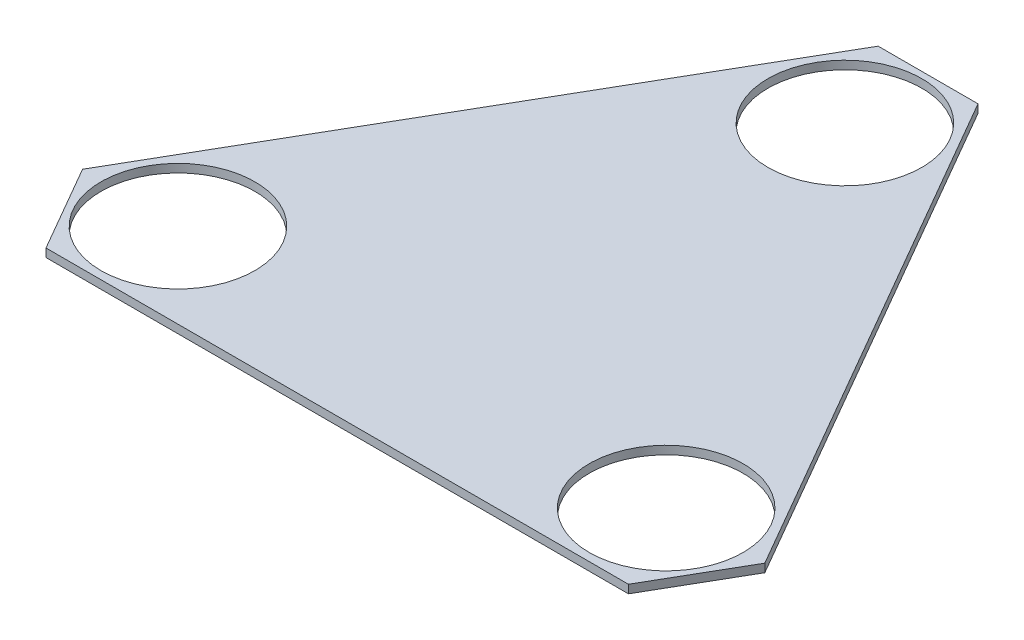
ISO-10303-21;
HEADER;
FILE_DESCRIPTION(('STEP AP214'),'2;1');
FILE_NAME('part.step','',(''),(''),'','','');
FILE_SCHEMA(('AUTOMOTIVE_DESIGN { 1 0 10303 214 1 1 1 1 }'));
ENDSEC;
DATA;
#1=APPLICATION_CONTEXT('core data for automotive mechanical design processes');
#2=APPLICATION_PROTOCOL_DEFINITION('international standard','automotive_design',2000,#1);
#3=PRODUCT_CONTEXT('',#1,'mechanical');
#4=PRODUCT('Part','Part','',(#3));
#5=PRODUCT_RELATED_PRODUCT_CATEGORY('part','',(#4));
#6=PRODUCT_DEFINITION_FORMATION('','',#4);
#7=PRODUCT_DEFINITION_CONTEXT('part definition',#1,'design');
#8=PRODUCT_DEFINITION('design','',#6,#7);
#9=PRODUCT_DEFINITION_SHAPE('','',#8);
#10=(LENGTH_UNIT() NAMED_UNIT(*) SI_UNIT(.MILLI.,.METRE.));
#11=(NAMED_UNIT(*) PLANE_ANGLE_UNIT() SI_UNIT($,.RADIAN.));
#12=(NAMED_UNIT(*) SI_UNIT($,.STERADIAN.) SOLID_ANGLE_UNIT());
#13=UNCERTAINTY_MEASURE_WITH_UNIT(LENGTH_MEASURE(1.E-05),#10,'distance_accuracy_value','');
#14=(GEOMETRIC_REPRESENTATION_CONTEXT(3) GLOBAL_UNCERTAINTY_ASSIGNED_CONTEXT((#13)) GLOBAL_UNIT_ASSIGNED_CONTEXT((#10,
#11,#12)) REPRESENTATION_CONTEXT('',''));
#15=CARTESIAN_POINT('',(0.,0.,0.));
#16=DIRECTION('',(0.,0.,1.));
#17=DIRECTION('',(1.,0.,0.));
#18=AXIS2_PLACEMENT_3D('',#15,#16,#17);
#19=CARTESIAN_POINT('',(-60.0000000000004,10.,-103.923048454132));
#20=DIRECTION('',(0.866025403784435,0.,-0.500000000000006));
#21=DIRECTION('',(-0.500000000000006,0.,-0.866025403784435));
#22=AXIS2_PLACEMENT_3D('',#19,#20,#21);
#23=PLANE('',#22);
#24=DIRECTION('',(0.500000000000006,0.,0.866025403784435));
#25=VECTOR('',#24,1.);
#26=CARTESIAN_POINT('',(-60.0000000000004,0.,-103.923048454132));
#27=LINE('',#26,#25);
#28=CARTESIAN_POINT('',(-60.0000000000004,0.,-103.923048454132));
#29=VERTEX_POINT('',#28);
#30=CARTESIAN_POINT('',(0.,0.,0.));
#31=VERTEX_POINT('',#30);
#32=EDGE_CURVE('E118',#29,#31,#27,.T.);
#33=ORIENTED_EDGE('',*,*,#32,.T.);
#34=DIRECTION('',(0.,-1.,0.));
#35=VECTOR('',#34,1.);
#36=CARTESIAN_POINT('',(0.,10.,0.));
#37=LINE('',#36,#35);
#38=CARTESIAN_POINT('',(0.,10.,0.));
#39=VERTEX_POINT('',#38);
#40=EDGE_CURVE('E11',#39,#31,#37,.T.);
#41=ORIENTED_EDGE('',*,*,#40,.F.);
#42=DIRECTION('',(0.500000000000006,0.,0.866025403784435));
#43=VECTOR('',#42,1.);
#44=CARTESIAN_POINT('',(-60.0000000000004,10.,-103.923048454132));
#45=LINE('',#44,#43);
#46=CARTESIAN_POINT('',(-60.0000000000004,10.,-103.923048454132));
#47=VERTEX_POINT('',#46);
#48=EDGE_CURVE('E129',#47,#39,#45,.T.);
#49=ORIENTED_EDGE('',*,*,#48,.F.);
#50=DIRECTION('',(0.,-1.,0.));
#51=VECTOR('',#50,1.);
#52=CARTESIAN_POINT('',(-60.0000000000004,10.,-103.923048454132));
#53=LINE('',#52,#51);
#54=EDGE_CURVE('E114',#47,#29,#53,.T.);
#55=ORIENTED_EDGE('',*,*,#54,.T.);
#56=EDGE_LOOP('',(#33,#41,#49,#55));
#57=FACE_BOUND('',#56,.T.);
#58=ADVANCED_FACE('F34',(#57),#23,.F.);
#59=CARTESIAN_POINT('',(0.,10.,0.));
#60=DIRECTION('',(0.,0.,-1.));
#61=DIRECTION('',(-1.,0.,0.));
#62=AXIS2_PLACEMENT_3D('',#59,#60,#61);
#63=PLANE('',#62);
#64=DIRECTION('',(1.,0.,0.));
#65=VECTOR('',#64,1.);
#66=CARTESIAN_POINT('',(0.,0.,0.));
#67=LINE('',#66,#65);
#68=CARTESIAN_POINT('',(700.,0.,0.));
#69=VERTEX_POINT('',#68);
#70=EDGE_CURVE('E121',#31,#69,#67,.T.);
#71=ORIENTED_EDGE('',*,*,#70,.T.);
#72=DIRECTION('',(0.,-1.,0.));
#73=VECTOR('',#72,1.);
#74=CARTESIAN_POINT('',(700.,10.,0.));
#75=LINE('',#74,#73);
#76=CARTESIAN_POINT('',(700.,10.,0.));
#77=VERTEX_POINT('',#76);
#78=EDGE_CURVE('E42',#77,#69,#75,.T.);
#79=ORIENTED_EDGE('',*,*,#78,.F.);
#80=DIRECTION('',(1.,0.,0.));
#81=VECTOR('',#80,1.);
#82=CARTESIAN_POINT('',(0.,10.,0.));
#83=LINE('',#82,#81);
#84=EDGE_CURVE('E87',#39,#77,#83,.T.);
#85=ORIENTED_EDGE('',*,*,#84,.F.);
#86=ORIENTED_EDGE('',*,*,#40,.T.);
#87=EDGE_LOOP('',(#71,#79,#85,#86));
#88=FACE_BOUND('',#87,.T.);
#89=ADVANCED_FACE('F154',(#88),#63,.F.);
#90=CARTESIAN_POINT('',(700.,10.,0.));
#91=DIRECTION('',(-0.866025403784441,0.,-0.499999999999996));
#92=DIRECTION('',(-0.499999999999996,0.,0.866025403784441));
#93=AXIS2_PLACEMENT_3D('',#90,#91,#92);
#94=PLANE('',#93);
#95=DIRECTION('',(0.499999999999996,0.,-0.866025403784441));
#96=VECTOR('',#95,1.);
#97=CARTESIAN_POINT('',(700.,0.,0.));
#98=LINE('',#97,#96);
#99=CARTESIAN_POINT('',(759.999999999999,0.,-103.923048454133));
#100=VERTEX_POINT('',#99);
#101=EDGE_CURVE('E124',#69,#100,#98,.T.);
#102=ORIENTED_EDGE('',*,*,#101,.T.);
#103=DIRECTION('',(0.,-1.,0.));
#104=VECTOR('',#103,1.);
#105=CARTESIAN_POINT('',(759.999999999999,10.,-103.923048454133));
#106=LINE('',#105,#104);
#107=CARTESIAN_POINT('',(759.999999999999,10.,-103.923048454133));
#108=VERTEX_POINT('',#107);
#109=EDGE_CURVE('E109',#108,#100,#106,.T.);
#110=ORIENTED_EDGE('',*,*,#109,.F.);
#111=DIRECTION('',(0.499999999999996,0.,-0.866025403784441));
#112=VECTOR('',#111,1.);
#113=CARTESIAN_POINT('',(700.,10.,0.));
#114=LINE('',#113,#112);
#115=EDGE_CURVE('E100',#77,#108,#114,.T.);
#116=ORIENTED_EDGE('',*,*,#115,.F.);
#117=ORIENTED_EDGE('',*,*,#78,.T.);
#118=EDGE_LOOP('',(#102,#110,#116,#117));
#119=FACE_BOUND('',#118,.T.);
#120=ADVANCED_FACE('F135',(#119),#94,.F.);
#121=CARTESIAN_POINT('',(759.999999999999,10.,-103.923048454133));
#122=DIRECTION('',(-0.866025403784435,0.,0.500000000000006));
#123=DIRECTION('',(0.500000000000006,0.,0.866025403784435));
#124=AXIS2_PLACEMENT_3D('',#121,#122,#123);
#125=PLANE('',#124);
#126=DIRECTION('',(-0.500000000000006,0.,-0.866025403784435));
#127=VECTOR('',#126,1.);
#128=CARTESIAN_POINT('',(759.999999999999,0.,-103.923048454133));
#129=LINE('',#128,#127);
#130=CARTESIAN_POINT('',(409.999999999995,0.,-710.140831103237));
#131=VERTEX_POINT('',#130);
#132=EDGE_CURVE('E108',#100,#131,#129,.T.);
#133=ORIENTED_EDGE('',*,*,#132,.T.);
#134=DIRECTION('',(0.,-1.,0.));
#135=VECTOR('',#134,1.);
#136=CARTESIAN_POINT('',(409.999999999995,10.,-710.140831103237));
#137=LINE('',#136,#135);
#138=CARTESIAN_POINT('',(409.999999999995,10.,-710.140831103237));
#139=VERTEX_POINT('',#138);
#140=EDGE_CURVE('E105',#139,#131,#137,.T.);
#141=ORIENTED_EDGE('',*,*,#140,.F.);
#142=DIRECTION('',(-0.500000000000006,0.,-0.866025403784435));
#143=VECTOR('',#142,1.);
#144=CARTESIAN_POINT('',(759.999999999999,10.,-103.923048454133));
#145=LINE('',#144,#143);
#146=EDGE_CURVE('E94',#108,#139,#145,.T.);
#147=ORIENTED_EDGE('',*,*,#146,.F.);
#148=ORIENTED_EDGE('',*,*,#109,.T.);
#149=EDGE_LOOP('',(#133,#141,#147,#148));
#150=FACE_BOUND('',#149,.T.);
#151=ADVANCED_FACE('F106',(#150),#125,.F.);
#152=CARTESIAN_POINT('',(409.999999999995,10.,-710.140831103237));
#153=DIRECTION('',(0.,0.,1.));
#154=DIRECTION('',(1.,0.,0.));
#155=AXIS2_PLACEMENT_3D('',#152,#153,#154);
#156=PLANE('',#155);
#157=DIRECTION('',(-1.,0.,0.));
#158=VECTOR('',#157,1.);
#159=CARTESIAN_POINT('',(409.999999999995,0.,-710.140831103237));
#160=LINE('',#159,#158);
#161=CARTESIAN_POINT('',(289.999999999995,0.,-710.140831103237));
#162=VERTEX_POINT('',#161);
#163=EDGE_CURVE('E73',#131,#162,#160,.T.);
#164=ORIENTED_EDGE('',*,*,#163,.T.);
#165=DIRECTION('',(0.,-1.,0.));
#166=VECTOR('',#165,1.);
#167=CARTESIAN_POINT('',(289.999999999995,10.,-710.140831103237));
#168=LINE('',#167,#166);
#169=CARTESIAN_POINT('',(289.999999999995,10.,-710.140831103237));
#170=VERTEX_POINT('',#169);
#171=EDGE_CURVE('E110',#170,#162,#168,.T.);
#172=ORIENTED_EDGE('',*,*,#171,.F.);
#173=DIRECTION('',(-1.,0.,0.));
#174=VECTOR('',#173,1.);
#175=CARTESIAN_POINT('',(409.999999999995,10.,-710.140831103237));
#176=LINE('',#175,#174);
#177=EDGE_CURVE('E98',#139,#170,#176,.T.);
#178=ORIENTED_EDGE('',*,*,#177,.F.);
#179=ORIENTED_EDGE('',*,*,#140,.T.);
#180=EDGE_LOOP('',(#164,#172,#178,#179));
#181=FACE_BOUND('',#180,.T.);
#182=ADVANCED_FACE('F112',(#181),#156,.F.);
#183=CARTESIAN_POINT('',(289.999999999995,10.,-710.140831103237));
#184=DIRECTION('',(0.866025403784441,0.,0.499999999999996));
#185=DIRECTION('',(0.499999999999996,0.,-0.866025403784441));
#186=AXIS2_PLACEMENT_3D('',#183,#184,#185);
#187=PLANE('',#186);
#188=DIRECTION('',(-0.499999999999996,0.,0.866025403784441));
#189=VECTOR('',#188,1.);
#190=CARTESIAN_POINT('',(289.999999999995,0.,-710.140831103237));
#191=LINE('',#190,#189);
#192=EDGE_CURVE('E79',#162,#29,#191,.T.);
#193=ORIENTED_EDGE('',*,*,#192,.T.);
#194=ORIENTED_EDGE('',*,*,#54,.F.);
#195=DIRECTION('',(-0.499999999999996,0.,0.866025403784441));
#196=VECTOR('',#195,1.);
#197=CARTESIAN_POINT('',(289.999999999995,10.,-710.140831103237));
#198=LINE('',#197,#196);
#199=EDGE_CURVE('E50',#170,#47,#198,.T.);
#200=ORIENTED_EDGE('',*,*,#199,.F.);
#201=ORIENTED_EDGE('',*,*,#171,.T.);
#202=EDGE_LOOP('',(#193,#194,#200,#201));
#203=FACE_BOUND('',#202,.T.);
#204=ADVANCED_FACE('F142',(#203),#187,.F.);
#205=CARTESIAN_POINT('',(0.,10.,0.));
#206=DIRECTION('',(0.,1.,0.));
#207=DIRECTION('',(0.,0.,1.));
#208=AXIS2_PLACEMENT_3D('',#205,#206,#207);
#209=PLANE('',#208);
#210=CARTESIAN_POINT('',(349.999999999995,10.,-610.140831103237));
#211=DIRECTION('',(0.,1.,0.));
#212=DIRECTION('',(0.,0.,1.));
#213=AXIS2_PLACEMENT_3D('',#210,#211,#212);
#214=CIRCLE('',#213,92.5);
#215=CARTESIAN_POINT('',(349.999999999995,10.,-517.640831103238));
#216=VERTEX_POINT('',#215);
#217=EDGE_CURVE('E229',#216,#216,#214,.T.);
#218=ORIENTED_EDGE('',*,*,#217,.F.);
#219=EDGE_LOOP('',(#218));
#220=FACE_BOUND('',#219,.T.);
#221=CARTESIAN_POINT('',(56.6025403784437,10.,-101.961524227066));
#222=DIRECTION('',(0.,1.,0.));
#223=DIRECTION('',(0.,0.,1.));
#224=AXIS2_PLACEMENT_3D('',#221,#222,#223);
#225=CIRCLE('',#224,92.5);
#226=CARTESIAN_POINT('',(56.6025403784437,10.,-9.4615242270658));
#227=VERTEX_POINT('',#226);
#228=EDGE_CURVE('E230',#227,#227,#225,.T.);
#229=ORIENTED_EDGE('',*,*,#228,.F.);
#230=EDGE_LOOP('',(#229));
#231=FACE_BOUND('',#230,.T.);
#232=CARTESIAN_POINT('',(643.397459621556,10.,-101.961524227067));
#233=DIRECTION('',(0.,1.,0.));
#234=DIRECTION('',(0.,0.,1.));
#235=AXIS2_PLACEMENT_3D('',#232,#233,#234);
#236=CIRCLE('',#235,92.5000000000001);
#237=CARTESIAN_POINT('',(643.397459621556,10.,-9.46152422706645));
#238=VERTEX_POINT('',#237);
#239=EDGE_CURVE('E239',#238,#238,#236,.T.);
#240=ORIENTED_EDGE('',*,*,#239,.F.);
#241=EDGE_LOOP('',(#240));
#242=FACE_BOUND('',#241,.T.);
#243=ORIENTED_EDGE('',*,*,#48,.T.);
#244=ORIENTED_EDGE('',*,*,#84,.T.);
#245=ORIENTED_EDGE('',*,*,#115,.T.);
#246=ORIENTED_EDGE('',*,*,#146,.T.);
#247=ORIENTED_EDGE('',*,*,#177,.T.);
#248=ORIENTED_EDGE('',*,*,#199,.T.);
#249=EDGE_LOOP('',(#243,#244,#245,#246,#247,#248));
#250=FACE_BOUND('',#249,.T.);
#251=ADVANCED_FACE('F96',(#220,#231,#242,#250),#209,.T.);
#252=CARTESIAN_POINT('',(0.,0.,0.));
#253=DIRECTION('',(0.,1.,0.));
#254=DIRECTION('',(0.,0.,1.));
#255=AXIS2_PLACEMENT_3D('',#252,#253,#254);
#256=PLANE('',#255);
#257=CARTESIAN_POINT('',(349.999999999995,0.,-610.140831103237));
#258=DIRECTION('',(0.,1.,0.));
#259=DIRECTION('',(0.,0.,1.));
#260=AXIS2_PLACEMENT_3D('',#257,#258,#259);
#261=CIRCLE('',#260,92.5);
#262=CARTESIAN_POINT('',(349.999999999995,0.,-517.640831103238));
#263=VERTEX_POINT('',#262);
#264=EDGE_CURVE('E122',#263,#263,#261,.T.);
#265=ORIENTED_EDGE('',*,*,#264,.T.);
#266=EDGE_LOOP('',(#265));
#267=FACE_BOUND('',#266,.T.);
#268=CARTESIAN_POINT('',(56.6025403784437,0.,-101.961524227066));
#269=DIRECTION('',(0.,1.,0.));
#270=DIRECTION('',(0.,0.,1.));
#271=AXIS2_PLACEMENT_3D('',#268,#269,#270);
#272=CIRCLE('',#271,92.5);
#273=CARTESIAN_POINT('',(56.6025403784437,0.,-9.4615242270658));
#274=VERTEX_POINT('',#273);
#275=EDGE_CURVE('E234',#274,#274,#272,.T.);
#276=ORIENTED_EDGE('',*,*,#275,.T.);
#277=EDGE_LOOP('',(#276));
#278=FACE_BOUND('',#277,.T.);
#279=CARTESIAN_POINT('',(643.397459621556,0.,-101.961524227067));
#280=DIRECTION('',(0.,1.,0.));
#281=DIRECTION('',(0.,0.,1.));
#282=AXIS2_PLACEMENT_3D('',#279,#280,#281);
#283=CIRCLE('',#282,92.5000000000001);
#284=CARTESIAN_POINT('',(643.397459621556,0.,-9.46152422706645));
#285=VERTEX_POINT('',#284);
#286=EDGE_CURVE('E242',#285,#285,#283,.T.);
#287=ORIENTED_EDGE('',*,*,#286,.T.);
#288=EDGE_LOOP('',(#287));
#289=FACE_BOUND('',#288,.T.);
#290=ORIENTED_EDGE('',*,*,#32,.F.);
#291=ORIENTED_EDGE('',*,*,#192,.F.);
#292=ORIENTED_EDGE('',*,*,#163,.F.);
#293=ORIENTED_EDGE('',*,*,#132,.F.);
#294=ORIENTED_EDGE('',*,*,#101,.F.);
#295=ORIENTED_EDGE('',*,*,#70,.F.);
#296=EDGE_LOOP('',(#290,#291,#292,#293,#294,#295));
#297=FACE_BOUND('',#296,.T.);
#298=ADVANCED_FACE('F138',(#267,#278,#289,#297),#256,.F.);
#299=CARTESIAN_POINT('',(643.397459621556,0.,-101.961524227067));
#300=DIRECTION('',(0.,1.,0.));
#301=DIRECTION('',(0.,0.,1.));
#302=AXIS2_PLACEMENT_3D('',#299,#300,#301);
#303=CYLINDRICAL_SURFACE('',#302,92.5000000000001);
#304=ORIENTED_EDGE('',*,*,#286,.F.);
#305=EDGE_LOOP('',(#304));
#306=FACE_BOUND('',#305,.T.);
#307=ORIENTED_EDGE('',*,*,#239,.T.);
#308=EDGE_LOOP('',(#307));
#309=FACE_BOUND('',#308,.T.);
#310=ADVANCED_FACE('F191',(#306,#309),#303,.F.);
#311=CARTESIAN_POINT('',(56.6025403784437,0.,-101.961524227066));
#312=DIRECTION('',(0.,1.,0.));
#313=DIRECTION('',(0.,0.,1.));
#314=AXIS2_PLACEMENT_3D('',#311,#312,#313);
#315=CYLINDRICAL_SURFACE('',#314,92.5);
#316=ORIENTED_EDGE('',*,*,#275,.F.);
#317=EDGE_LOOP('',(#316));
#318=FACE_BOUND('',#317,.T.);
#319=ORIENTED_EDGE('',*,*,#228,.T.);
#320=EDGE_LOOP('',(#319));
#321=FACE_BOUND('',#320,.T.);
#322=ADVANCED_FACE('F200',(#318,#321),#315,.F.);
#323=CARTESIAN_POINT('',(349.999999999995,0.,-610.140831103237));
#324=DIRECTION('',(0.,1.,0.));
#325=DIRECTION('',(0.,0.,1.));
#326=AXIS2_PLACEMENT_3D('',#323,#324,#325);
#327=CYLINDRICAL_SURFACE('',#326,92.5);
#328=ORIENTED_EDGE('',*,*,#264,.F.);
#329=EDGE_LOOP('',(#328));
#330=FACE_BOUND('',#329,.T.);
#331=ORIENTED_EDGE('',*,*,#217,.T.);
#332=EDGE_LOOP('',(#331));
#333=FACE_BOUND('',#332,.T.);
#334=ADVANCED_FACE('F210',(#330,#333),#327,.F.);
#335=CLOSED_SHELL('',(#58,#89,#120,#151,#182,#204,#251,#298,#310,#322,#334));
#336=MANIFOLD_SOLID_BREP('B2',#335);
#337=ADVANCED_BREP_SHAPE_REPRESENTATION('',(#18,#336),#14);
#338=SHAPE_DEFINITION_REPRESENTATION(#9,#337);
ENDSEC;
END-ISO-10303-21;
